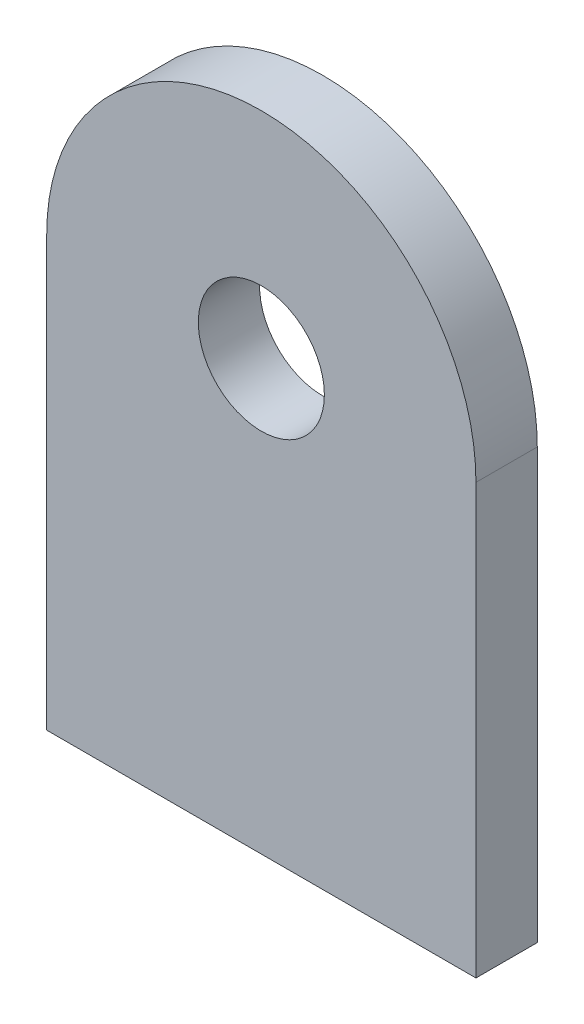
ISO-10303-21;
HEADER;
FILE_DESCRIPTION(('STEP AP214'),'2;1');
FILE_NAME('part.step','',(''),(''),'','','');
FILE_SCHEMA(('AUTOMOTIVE_DESIGN { 1 0 10303 214 1 1 1 1 }'));
ENDSEC;
DATA;
#1=APPLICATION_CONTEXT('core data for automotive mechanical design processes');
#2=APPLICATION_PROTOCOL_DEFINITION('international standard','automotive_design',2000,#1);
#3=PRODUCT_CONTEXT('',#1,'mechanical');
#4=PRODUCT('Part','Part','',(#3));
#5=PRODUCT_RELATED_PRODUCT_CATEGORY('part','',(#4));
#6=PRODUCT_DEFINITION_FORMATION('','',#4);
#7=PRODUCT_DEFINITION_CONTEXT('part definition',#1,'design');
#8=PRODUCT_DEFINITION('design','',#6,#7);
#9=PRODUCT_DEFINITION_SHAPE('','',#8);
#10=(LENGTH_UNIT() NAMED_UNIT(*) SI_UNIT(.MILLI.,.METRE.));
#11=(NAMED_UNIT(*) PLANE_ANGLE_UNIT() SI_UNIT($,.RADIAN.));
#12=(NAMED_UNIT(*) SI_UNIT($,.STERADIAN.) SOLID_ANGLE_UNIT());
#13=UNCERTAINTY_MEASURE_WITH_UNIT(LENGTH_MEASURE(1.E-05),#10,'distance_accuracy_value','');
#14=(GEOMETRIC_REPRESENTATION_CONTEXT(3) GLOBAL_UNCERTAINTY_ASSIGNED_CONTEXT((#13)) GLOBAL_UNIT_ASSIGNED_CONTEXT((#10,
#11,#12)) REPRESENTATION_CONTEXT('',''));
#15=CARTESIAN_POINT('',(0.,0.,0.));
#16=DIRECTION('',(0.,0.,1.));
#17=DIRECTION('',(1.,0.,0.));
#18=AXIS2_PLACEMENT_3D('',#15,#16,#17);
#19=CARTESIAN_POINT('',(11.1125,22.225,3.175));
#20=DIRECTION('',(0.,0.,1.));
#21=DIRECTION('',(1.,0.,0.));
#22=AXIS2_PLACEMENT_3D('',#19,#20,#21);
#23=PLANE('',#22);
#24=DIRECTION('',(0.,-1.,0.));
#25=VECTOR('',#24,1.);
#26=CARTESIAN_POINT('',(0.,22.225,3.175));
#27=LINE('',#26,#25);
#28=CARTESIAN_POINT('',(0.,22.225,3.175));
#29=VERTEX_POINT('',#28);
#30=CARTESIAN_POINT('',(0.,0.,3.175));
#31=VERTEX_POINT('',#30);
#32=EDGE_CURVE('E95',#29,#31,#27,.T.);
#33=ORIENTED_EDGE('',*,*,#32,.T.);
#34=DIRECTION('',(1.,0.,0.));
#35=VECTOR('',#34,1.);
#36=CARTESIAN_POINT('',(0.,0.,3.175));
#37=LINE('',#36,#35);
#38=CARTESIAN_POINT('',(22.225,0.,3.175));
#39=VERTEX_POINT('',#38);
#40=EDGE_CURVE('E90',#31,#39,#37,.T.);
#41=ORIENTED_EDGE('',*,*,#40,.T.);
#42=DIRECTION('',(0.,1.,0.));
#43=VECTOR('',#42,1.);
#44=CARTESIAN_POINT('',(22.225,0.,3.175));
#45=LINE('',#44,#43);
#46=CARTESIAN_POINT('',(22.225,22.225,3.175));
#47=VERTEX_POINT('',#46);
#48=EDGE_CURVE('E93',#39,#47,#45,.T.);
#49=ORIENTED_EDGE('',*,*,#48,.T.);
#50=CARTESIAN_POINT('',(11.1125,22.225,3.175));
#51=DIRECTION('',(0.,0.,1.));
#52=DIRECTION('',(1.,0.,0.));
#53=AXIS2_PLACEMENT_3D('',#50,#51,#52);
#54=CIRCLE('',#53,11.1125);
#55=EDGE_CURVE('E60',#47,#29,#54,.T.);
#56=ORIENTED_EDGE('',*,*,#55,.T.);
#57=EDGE_LOOP('',(#33,#41,#49,#56));
#58=FACE_BOUND('',#57,.T.);
#59=CARTESIAN_POINT('',(11.1125,22.225,3.175));
#60=DIRECTION('',(0.,0.,1.));
#61=DIRECTION('',(1.,0.,0.));
#62=AXIS2_PLACEMENT_3D('',#59,#60,#61);
#63=CIRCLE('',#62,3.26390000000001);
#64=CARTESIAN_POINT('',(14.3764,22.225,3.175));
#65=VERTEX_POINT('',#64);
#66=EDGE_CURVE('E110',#65,#65,#63,.T.);
#67=ORIENTED_EDGE('',*,*,#66,.F.);
#68=EDGE_LOOP('',(#67));
#69=FACE_BOUND('',#68,.T.);
#70=ADVANCED_FACE('F43',(#58,#69),#23,.T.);
#71=CARTESIAN_POINT('',(11.1125,22.225,0.));
#72=DIRECTION('',(0.,0.,1.));
#73=DIRECTION('',(1.,0.,0.));
#74=AXIS2_PLACEMENT_3D('',#71,#72,#73);
#75=PLANE('',#74);
#76=DIRECTION('',(0.,-1.,0.));
#77=VECTOR('',#76,1.);
#78=CARTESIAN_POINT('',(0.,22.225,0.));
#79=LINE('',#78,#77);
#80=CARTESIAN_POINT('',(0.,22.225,0.));
#81=VERTEX_POINT('',#80);
#82=CARTESIAN_POINT('',(0.,0.,0.));
#83=VERTEX_POINT('',#82);
#84=EDGE_CURVE('E107',#81,#83,#79,.T.);
#85=ORIENTED_EDGE('',*,*,#84,.F.);
#86=CARTESIAN_POINT('',(11.1125,22.225,0.));
#87=DIRECTION('',(0.,0.,1.));
#88=DIRECTION('',(1.,0.,0.));
#89=AXIS2_PLACEMENT_3D('',#86,#87,#88);
#90=CIRCLE('',#89,11.1125);
#91=CARTESIAN_POINT('',(22.225,22.225,0.));
#92=VERTEX_POINT('',#91);
#93=EDGE_CURVE('E83',#92,#81,#90,.T.);
#94=ORIENTED_EDGE('',*,*,#93,.F.);
#95=DIRECTION('',(0.,1.,0.));
#96=VECTOR('',#95,1.);
#97=CARTESIAN_POINT('',(22.225,0.,0.));
#98=LINE('',#97,#96);
#99=CARTESIAN_POINT('',(22.225,0.,0.));
#100=VERTEX_POINT('',#99);
#101=EDGE_CURVE('E77',#100,#92,#98,.T.);
#102=ORIENTED_EDGE('',*,*,#101,.F.);
#103=DIRECTION('',(1.,0.,0.));
#104=VECTOR('',#103,1.);
#105=CARTESIAN_POINT('',(0.,0.,0.));
#106=LINE('',#105,#104);
#107=EDGE_CURVE('E99',#83,#100,#106,.T.);
#108=ORIENTED_EDGE('',*,*,#107,.F.);
#109=EDGE_LOOP('',(#85,#94,#102,#108));
#110=FACE_BOUND('',#109,.T.);
#111=CARTESIAN_POINT('',(11.1125,22.225,0.));
#112=DIRECTION('',(0.,0.,1.));
#113=DIRECTION('',(1.,0.,0.));
#114=AXIS2_PLACEMENT_3D('',#111,#112,#113);
#115=CIRCLE('',#114,3.26390000000001);
#116=CARTESIAN_POINT('',(14.3764,22.225,0.));
#117=VERTEX_POINT('',#116);
#118=EDGE_CURVE('E122',#117,#117,#115,.T.);
#119=ORIENTED_EDGE('',*,*,#118,.T.);
#120=EDGE_LOOP('',(#119));
#121=FACE_BOUND('',#120,.T.);
#122=ADVANCED_FACE('F118',(#110,#121),#75,.F.);
#123=CARTESIAN_POINT('',(0.,22.225,3.175));
#124=DIRECTION('',(1.,0.,0.));
#125=DIRECTION('',(0.,0.,-1.));
#126=AXIS2_PLACEMENT_3D('',#123,#124,#125);
#127=PLANE('',#126);
#128=ORIENTED_EDGE('',*,*,#84,.T.);
#129=DIRECTION('',(0.,0.,-1.));
#130=VECTOR('',#129,1.);
#131=CARTESIAN_POINT('',(0.,0.,3.175));
#132=LINE('',#131,#130);
#133=EDGE_CURVE('E11',#31,#83,#132,.T.);
#134=ORIENTED_EDGE('',*,*,#133,.F.);
#135=ORIENTED_EDGE('',*,*,#32,.F.);
#136=DIRECTION('',(0.,0.,-1.));
#137=VECTOR('',#136,1.);
#138=CARTESIAN_POINT('',(0.,22.225,3.175));
#139=LINE('',#138,#137);
#140=EDGE_CURVE('E103',#29,#81,#139,.T.);
#141=ORIENTED_EDGE('',*,*,#140,.T.);
#142=EDGE_LOOP('',(#128,#134,#135,#141));
#143=FACE_BOUND('',#142,.T.);
#144=ADVANCED_FACE('F45',(#143),#127,.F.);
#145=CARTESIAN_POINT('',(0.,0.,3.175));
#146=DIRECTION('',(0.,1.,0.));
#147=DIRECTION('',(0.,0.,1.));
#148=AXIS2_PLACEMENT_3D('',#145,#146,#147);
#149=PLANE('',#148);
#150=ORIENTED_EDGE('',*,*,#107,.T.);
#151=DIRECTION('',(0.,0.,-1.));
#152=VECTOR('',#151,1.);
#153=CARTESIAN_POINT('',(22.225,0.,3.175));
#154=LINE('',#153,#152);
#155=EDGE_CURVE('E52',#39,#100,#154,.T.);
#156=ORIENTED_EDGE('',*,*,#155,.F.);
#157=ORIENTED_EDGE('',*,*,#40,.F.);
#158=ORIENTED_EDGE('',*,*,#133,.T.);
#159=EDGE_LOOP('',(#150,#156,#157,#158));
#160=FACE_BOUND('',#159,.T.);
#161=ADVANCED_FACE('F98',(#160),#149,.F.);
#162=CARTESIAN_POINT('',(22.225,0.,3.175));
#163=DIRECTION('',(-1.,0.,0.));
#164=DIRECTION('',(0.,-1.,0.));
#165=AXIS2_PLACEMENT_3D('',#162,#163,#164);
#166=PLANE('',#165);
#167=ORIENTED_EDGE('',*,*,#101,.T.);
#168=DIRECTION('',(0.,0.,-1.));
#169=VECTOR('',#168,1.);
#170=CARTESIAN_POINT('',(22.225,22.225,3.175));
#171=LINE('',#170,#169);
#172=EDGE_CURVE('E100',#47,#92,#171,.T.);
#173=ORIENTED_EDGE('',*,*,#172,.F.);
#174=ORIENTED_EDGE('',*,*,#48,.F.);
#175=ORIENTED_EDGE('',*,*,#155,.T.);
#176=EDGE_LOOP('',(#167,#173,#174,#175));
#177=FACE_BOUND('',#176,.T.);
#178=ADVANCED_FACE('F101',(#177),#166,.F.);
#179=CARTESIAN_POINT('',(11.1125,22.225,3.175));
#180=DIRECTION('',(0.,0.,-1.));
#181=DIRECTION('',(-1.,0.,0.));
#182=AXIS2_PLACEMENT_3D('',#179,#180,#181);
#183=CYLINDRICAL_SURFACE('',#182,11.1125);
#184=ORIENTED_EDGE('',*,*,#93,.T.);
#185=ORIENTED_EDGE('',*,*,#140,.F.);
#186=ORIENTED_EDGE('',*,*,#55,.F.);
#187=ORIENTED_EDGE('',*,*,#172,.T.);
#188=EDGE_LOOP('',(#184,#185,#186,#187));
#189=FACE_BOUND('',#188,.T.);
#190=ADVANCED_FACE('F115',(#189),#183,.T.);
#191=CARTESIAN_POINT('',(11.1125,22.225,3.175));
#192=DIRECTION('',(0.,0.,-1.));
#193=DIRECTION('',(-1.,0.,0.));
#194=AXIS2_PLACEMENT_3D('',#191,#192,#193);
#195=CYLINDRICAL_SURFACE('',#194,3.26390000000001);
#196=ORIENTED_EDGE('',*,*,#66,.T.);
#197=EDGE_LOOP('',(#196));
#198=FACE_BOUND('',#197,.T.);
#199=ORIENTED_EDGE('',*,*,#118,.F.);
#200=EDGE_LOOP('',(#199));
#201=FACE_BOUND('',#200,.T.);
#202=ADVANCED_FACE('F128',(#198,#201),#195,.F.);
#203=CLOSED_SHELL('',(#70,#122,#144,#161,#178,#190,#202));
#204=MANIFOLD_SOLID_BREP('B2',#203);
#205=ADVANCED_BREP_SHAPE_REPRESENTATION('',(#18,#204),#14);
#206=SHAPE_DEFINITION_REPRESENTATION(#9,#205);
ENDSEC;
END-ISO-10303-21;
